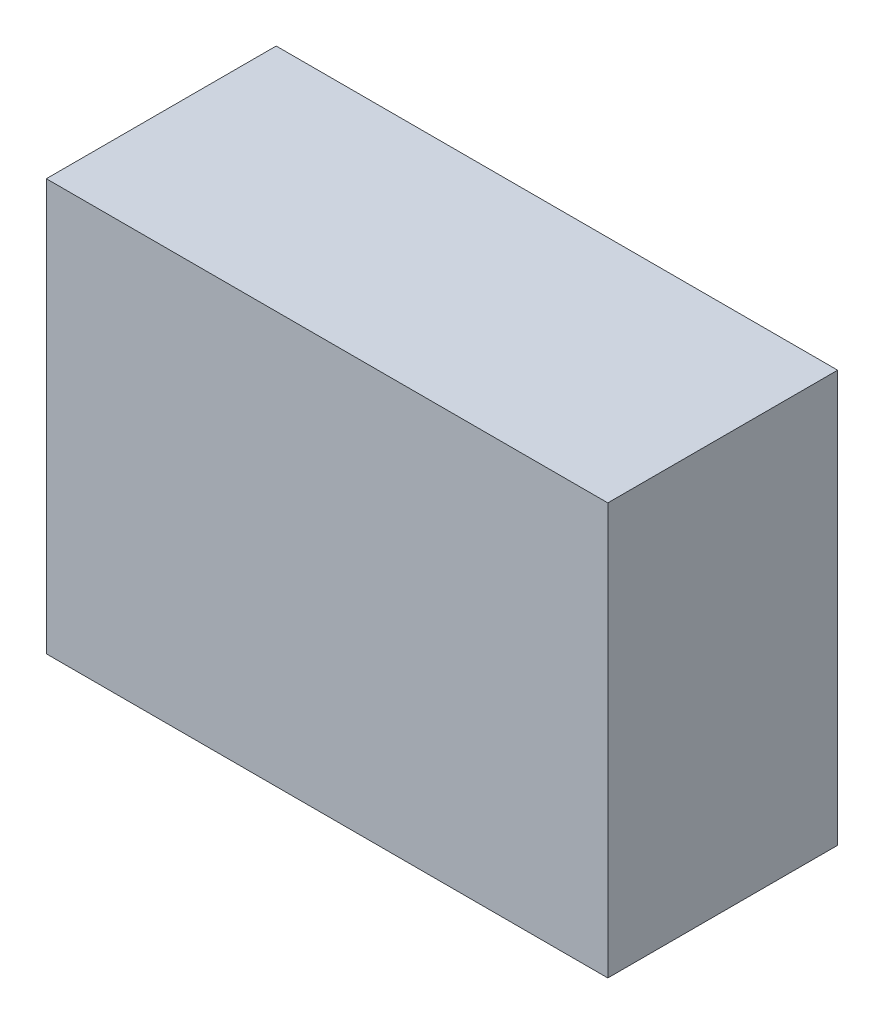
ISO-10303-21;
HEADER;
FILE_DESCRIPTION(('STEP AP214'),'2;1');
FILE_NAME('part.step','',(''),(''),'','','');
FILE_SCHEMA(('AUTOMOTIVE_DESIGN { 1 0 10303 214 1 1 1 1 }'));
ENDSEC;
DATA;
#1=APPLICATION_CONTEXT('core data for automotive mechanical design processes');
#2=APPLICATION_PROTOCOL_DEFINITION('international standard','automotive_design',2000,#1);
#3=PRODUCT_CONTEXT('',#1,'mechanical');
#4=PRODUCT('Part','Part','',(#3));
#5=PRODUCT_RELATED_PRODUCT_CATEGORY('part','',(#4));
#6=PRODUCT_DEFINITION_FORMATION('','',#4);
#7=PRODUCT_DEFINITION_CONTEXT('part definition',#1,'design');
#8=PRODUCT_DEFINITION('design','',#6,#7);
#9=PRODUCT_DEFINITION_SHAPE('','',#8);
#10=(LENGTH_UNIT() NAMED_UNIT(*) SI_UNIT(.MILLI.,.METRE.));
#11=(NAMED_UNIT(*) PLANE_ANGLE_UNIT() SI_UNIT($,.RADIAN.));
#12=(NAMED_UNIT(*) SI_UNIT($,.STERADIAN.) SOLID_ANGLE_UNIT());
#13=UNCERTAINTY_MEASURE_WITH_UNIT(LENGTH_MEASURE(1.E-05),#10,'distance_accuracy_value','');
#14=(GEOMETRIC_REPRESENTATION_CONTEXT(3) GLOBAL_UNCERTAINTY_ASSIGNED_CONTEXT((#13)) GLOBAL_UNIT_ASSIGNED_CONTEXT((#10,
#11,#12)) REPRESENTATION_CONTEXT('',''));
#15=CARTESIAN_POINT('',(0.,0.,0.));
#16=DIRECTION('',(0.,0.,1.));
#17=DIRECTION('',(1.,0.,0.));
#18=AXIS2_PLACEMENT_3D('',#15,#16,#17);
#19=CARTESIAN_POINT('',(32.,-23.45,26.2));
#20=DIRECTION('',(-1.,0.,0.));
#21=DIRECTION('',(0.,0.,1.));
#22=AXIS2_PLACEMENT_3D('',#19,#20,#21);
#23=PLANE('',#22);
#24=DIRECTION('',(0.,1.,0.));
#25=VECTOR('',#24,1.);
#26=CARTESIAN_POINT('',(32.,-23.45,0.));
#27=LINE('',#26,#25);
#28=CARTESIAN_POINT('',(32.,-23.45,0.));
#29=VERTEX_POINT('',#28);
#30=CARTESIAN_POINT('',(32.,23.45,0.));
#31=VERTEX_POINT('',#30);
#32=EDGE_CURVE('E102',#29,#31,#27,.T.);
#33=ORIENTED_EDGE('',*,*,#32,.T.);
#34=DIRECTION('',(0.,0.,-1.));
#35=VECTOR('',#34,1.);
#36=CARTESIAN_POINT('',(32.,23.45,26.2));
#37=LINE('',#36,#35);
#38=CARTESIAN_POINT('',(32.,23.45,26.2));
#39=VERTEX_POINT('',#38);
#40=EDGE_CURVE('E11',#39,#31,#37,.T.);
#41=ORIENTED_EDGE('',*,*,#40,.F.);
#42=DIRECTION('',(0.,1.,0.));
#43=VECTOR('',#42,1.);
#44=CARTESIAN_POINT('',(32.,-23.45,26.2));
#45=LINE('',#44,#43);
#46=CARTESIAN_POINT('',(32.,-23.45,26.2));
#47=VERTEX_POINT('',#46);
#48=EDGE_CURVE('E90',#47,#39,#45,.T.);
#49=ORIENTED_EDGE('',*,*,#48,.F.);
#50=DIRECTION('',(0.,0.,-1.));
#51=VECTOR('',#50,1.);
#52=CARTESIAN_POINT('',(32.,-23.45,26.2));
#53=LINE('',#52,#51);
#54=EDGE_CURVE('E98',#47,#29,#53,.T.);
#55=ORIENTED_EDGE('',*,*,#54,.T.);
#56=EDGE_LOOP('',(#33,#41,#49,#55));
#57=FACE_BOUND('',#56,.T.);
#58=ADVANCED_FACE('F39',(#57),#23,.F.);
#59=CARTESIAN_POINT('',(-32.,23.45,26.2));
#60=DIRECTION('',(0.,-1.,0.));
#61=DIRECTION('',(0.,0.,-1.));
#62=AXIS2_PLACEMENT_3D('',#59,#60,#61);
#63=PLANE('',#62);
#64=DIRECTION('',(-1.,0.,0.));
#65=VECTOR('',#64,1.);
#66=CARTESIAN_POINT('',(-32.,23.45,0.));
#67=LINE('',#66,#65);
#68=CARTESIAN_POINT('',(-32.,23.45,0.));
#69=VERTEX_POINT('',#68);
#70=EDGE_CURVE('E94',#31,#69,#67,.T.);
#71=ORIENTED_EDGE('',*,*,#70,.T.);
#72=DIRECTION('',(0.,0.,-1.));
#73=VECTOR('',#72,1.);
#74=CARTESIAN_POINT('',(-32.,23.45,26.2));
#75=LINE('',#74,#73);
#76=CARTESIAN_POINT('',(-32.,23.45,26.2));
#77=VERTEX_POINT('',#76);
#78=EDGE_CURVE('E47',#77,#69,#75,.T.);
#79=ORIENTED_EDGE('',*,*,#78,.F.);
#80=DIRECTION('',(-1.,0.,0.));
#81=VECTOR('',#80,1.);
#82=CARTESIAN_POINT('',(-32.,23.45,26.2));
#83=LINE('',#82,#81);
#84=EDGE_CURVE('E85',#39,#77,#83,.T.);
#85=ORIENTED_EDGE('',*,*,#84,.F.);
#86=ORIENTED_EDGE('',*,*,#40,.T.);
#87=EDGE_LOOP('',(#71,#79,#85,#86));
#88=FACE_BOUND('',#87,.T.);
#89=ADVANCED_FACE('F93',(#88),#63,.F.);
#90=CARTESIAN_POINT('',(-32.,-23.45,26.2));
#91=DIRECTION('',(1.,0.,0.));
#92=DIRECTION('',(0.,0.,-1.));
#93=AXIS2_PLACEMENT_3D('',#90,#91,#92);
#94=PLANE('',#93);
#95=DIRECTION('',(0.,-1.,0.));
#96=VECTOR('',#95,1.);
#97=CARTESIAN_POINT('',(-32.,-23.45,0.));
#98=LINE('',#97,#96);
#99=CARTESIAN_POINT('',(-32.,-23.45,0.));
#100=VERTEX_POINT('',#99);
#101=EDGE_CURVE('E72',#69,#100,#98,.T.);
#102=ORIENTED_EDGE('',*,*,#101,.T.);
#103=DIRECTION('',(0.,0.,-1.));
#104=VECTOR('',#103,1.);
#105=CARTESIAN_POINT('',(-32.,-23.45,26.2));
#106=LINE('',#105,#104);
#107=CARTESIAN_POINT('',(-32.,-23.45,26.2));
#108=VERTEX_POINT('',#107);
#109=EDGE_CURVE('E95',#108,#100,#106,.T.);
#110=ORIENTED_EDGE('',*,*,#109,.F.);
#111=DIRECTION('',(0.,-1.,0.));
#112=VECTOR('',#111,1.);
#113=CARTESIAN_POINT('',(-32.,-23.45,26.2));
#114=LINE('',#113,#112);
#115=EDGE_CURVE('E88',#77,#108,#114,.T.);
#116=ORIENTED_EDGE('',*,*,#115,.F.);
#117=ORIENTED_EDGE('',*,*,#78,.T.);
#118=EDGE_LOOP('',(#102,#110,#116,#117));
#119=FACE_BOUND('',#118,.T.);
#120=ADVANCED_FACE('F96',(#119),#94,.F.);
#121=CARTESIAN_POINT('',(-32.,-23.45,26.2));
#122=DIRECTION('',(0.,1.,0.));
#123=DIRECTION('',(0.,0.,1.));
#124=AXIS2_PLACEMENT_3D('',#121,#122,#123);
#125=PLANE('',#124);
#126=DIRECTION('',(1.,0.,0.));
#127=VECTOR('',#126,1.);
#128=CARTESIAN_POINT('',(-32.,-23.45,0.));
#129=LINE('',#128,#127);
#130=EDGE_CURVE('E78',#100,#29,#129,.T.);
#131=ORIENTED_EDGE('',*,*,#130,.T.);
#132=ORIENTED_EDGE('',*,*,#54,.F.);
#133=DIRECTION('',(1.,0.,0.));
#134=VECTOR('',#133,1.);
#135=CARTESIAN_POINT('',(-32.,-23.45,26.2));
#136=LINE('',#135,#134);
#137=EDGE_CURVE('E55',#108,#47,#136,.T.);
#138=ORIENTED_EDGE('',*,*,#137,.F.);
#139=ORIENTED_EDGE('',*,*,#109,.T.);
#140=EDGE_LOOP('',(#131,#132,#138,#139));
#141=FACE_BOUND('',#140,.T.);
#142=ADVANCED_FACE('F109',(#141),#125,.F.);
#143=CARTESIAN_POINT('',(0.,0.,26.2));
#144=DIRECTION('',(0.,0.,-1.));
#145=DIRECTION('',(-1.,0.,0.));
#146=AXIS2_PLACEMENT_3D('',#143,#144,#145);
#147=PLANE('',#146);
#148=ORIENTED_EDGE('',*,*,#48,.T.);
#149=ORIENTED_EDGE('',*,*,#84,.T.);
#150=ORIENTED_EDGE('',*,*,#115,.T.);
#151=ORIENTED_EDGE('',*,*,#137,.T.);
#152=EDGE_LOOP('',(#148,#149,#150,#151));
#153=FACE_BOUND('',#152,.T.);
#154=ADVANCED_FACE('F86',(#153),#147,.F.);
#155=CARTESIAN_POINT('',(0.,0.,0.));
#156=DIRECTION('',(0.,0.,-1.));
#157=DIRECTION('',(-1.,0.,0.));
#158=AXIS2_PLACEMENT_3D('',#155,#156,#157);
#159=PLANE('',#158);
#160=ORIENTED_EDGE('',*,*,#32,.F.);
#161=ORIENTED_EDGE('',*,*,#130,.F.);
#162=ORIENTED_EDGE('',*,*,#101,.F.);
#163=ORIENTED_EDGE('',*,*,#70,.F.);
#164=EDGE_LOOP('',(#160,#161,#162,#163));
#165=FACE_BOUND('',#164,.T.);
#166=ADVANCED_FACE('F112',(#165),#159,.T.);
#167=CLOSED_SHELL('',(#58,#89,#120,#142,#154,#166));
#168=MANIFOLD_SOLID_BREP('B2',#167);
#169=ADVANCED_BREP_SHAPE_REPRESENTATION('',(#18,#168),#14);
#170=SHAPE_DEFINITION_REPRESENTATION(#9,#169);
ENDSEC;
END-ISO-10303-21;
